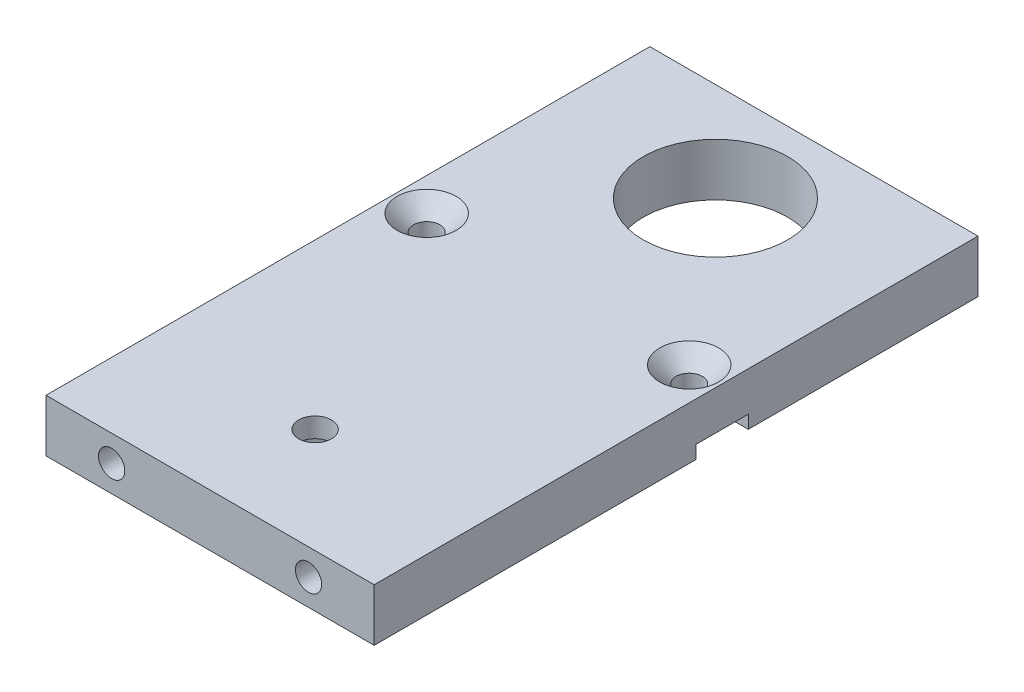
ISO-10303-21;
HEADER;
FILE_DESCRIPTION(('STEP AP214'),'2;1');
FILE_NAME('part.step','',(''),(''),'','','');
FILE_SCHEMA(('AUTOMOTIVE_DESIGN { 1 0 10303 214 1 1 1 1 }'));
ENDSEC;
DATA;
#1=APPLICATION_CONTEXT('core data for automotive mechanical design processes');
#2=APPLICATION_PROTOCOL_DEFINITION('international standard','automotive_design',2000,#1);
#3=PRODUCT_CONTEXT('',#1,'mechanical');
#4=PRODUCT('Part','Part','',(#3));
#5=PRODUCT_RELATED_PRODUCT_CATEGORY('part','',(#4));
#6=PRODUCT_DEFINITION_FORMATION('','',#4);
#7=PRODUCT_DEFINITION_CONTEXT('part definition',#1,'design');
#8=PRODUCT_DEFINITION('design','',#6,#7);
#9=PRODUCT_DEFINITION_SHAPE('','',#8);
#10=(LENGTH_UNIT() NAMED_UNIT(*) SI_UNIT(.MILLI.,.METRE.));
#11=(NAMED_UNIT(*) PLANE_ANGLE_UNIT() SI_UNIT($,.RADIAN.));
#12=(NAMED_UNIT(*) SI_UNIT($,.STERADIAN.) SOLID_ANGLE_UNIT());
#13=UNCERTAINTY_MEASURE_WITH_UNIT(LENGTH_MEASURE(1.E-05),#10,'distance_accuracy_value','');
#14=(GEOMETRIC_REPRESENTATION_CONTEXT(3) GLOBAL_UNCERTAINTY_ASSIGNED_CONTEXT((#13)) GLOBAL_UNIT_ASSIGNED_CONTEXT((#10,
#11,#12)) REPRESENTATION_CONTEXT('',''));
#15=CARTESIAN_POINT('',(0.,0.,0.));
#16=DIRECTION('',(0.,0.,1.));
#17=DIRECTION('',(1.,0.,0.));
#18=AXIS2_PLACEMENT_3D('',#15,#16,#17);
#19=CARTESIAN_POINT('',(0.,0.,0.));
#20=DIRECTION('',(0.,1.,0.));
#21=DIRECTION('',(0.,0.,1.));
#22=AXIS2_PLACEMENT_3D('',#19,#20,#21);
#23=PLANE('',#22);
#24=CARTESIAN_POINT('',(-6.49140893470789,0.,-4.88208118099477));
#25=DIRECTION('',(0.,1.,0.));
#26=DIRECTION('',(0.,0.,1.));
#27=AXIS2_PLACEMENT_3D('',#24,#25,#26);
#28=CIRCLE('',#27,11.);
#29=CARTESIAN_POINT('',(-6.49140893470789,0.,6.11791881900523));
#30=VERTEX_POINT('',#29);
#31=EDGE_CURVE('E162',#30,#30,#28,.T.);
#32=ORIENTED_EDGE('',*,*,#31,.T.);
#33=EDGE_LOOP('',(#32));
#34=FACE_BOUND('',#33,.T.);
#35=DIRECTION('',(0.,0.,-1.));
#36=VECTOR('',#35,1.);
#37=CARTESIAN_POINT('',(18.5085910652921,0.,-19.8820811809948));
#38=LINE('',#37,#36);
#39=CARTESIAN_POINT('',(18.5085910652921,0.,15.1179188190052));
#40=VERTEX_POINT('',#39);
#41=CARTESIAN_POINT('',(18.5085910652921,0.,-19.8820811809948));
#42=VERTEX_POINT('',#41);
#43=EDGE_CURVE('E183',#40,#42,#38,.T.);
#44=ORIENTED_EDGE('',*,*,#43,.F.);
#45=DIRECTION('',(1.,0.,0.));
#46=VECTOR('',#45,1.);
#47=CARTESIAN_POINT('',(18.5085910652921,0.,15.1179188190052));
#48=LINE('',#47,#46);
#49=CARTESIAN_POINT('',(-31.4914089347079,0.,15.1179188190052));
#50=VERTEX_POINT('',#49);
#51=EDGE_CURVE('E124',#50,#40,#48,.T.);
#52=ORIENTED_EDGE('',*,*,#51,.F.);
#53=DIRECTION('',(0.,0.,1.));
#54=VECTOR('',#53,1.);
#55=CARTESIAN_POINT('',(-31.4914089347079,0.,-19.8820811809948));
#56=LINE('',#55,#54);
#57=CARTESIAN_POINT('',(-31.4914089347079,0.,-19.8820811809948));
#58=VERTEX_POINT('',#57);
#59=EDGE_CURVE('E178',#58,#50,#56,.T.);
#60=ORIENTED_EDGE('',*,*,#59,.F.);
#61=DIRECTION('',(-1.,0.,0.));
#62=VECTOR('',#61,1.);
#63=CARTESIAN_POINT('',(-31.4914089347079,0.,-19.8820811809948));
#64=LINE('',#63,#62);
#65=EDGE_CURVE('E79',#42,#58,#64,.T.);
#66=ORIENTED_EDGE('',*,*,#65,.F.);
#67=EDGE_LOOP('',(#44,#52,#60,#66));
#68=FACE_BOUND('',#67,.T.);
#69=ADVANCED_FACE('F33',(#34,#68),#23,.F.);
#70=CARTESIAN_POINT('',(-26.4914089347079,8.,19.1179188190052));
#71=DIRECTION('',(0.,-1.,0.));
#72=DIRECTION('',(0.,0.,-1.));
#73=AXIS2_PLACEMENT_3D('',#70,#71,#72);
#74=CYLINDRICAL_SURFACE('',#73,2.);
#75=CARTESIAN_POINT('',(-26.4914089347079,5.50000000000002,19.1179188190052));
#76=DIRECTION('',(0.,1.,0.));
#77=DIRECTION('',(0.,0.,1.));
#78=AXIS2_PLACEMENT_3D('',#75,#76,#77);
#79=CIRCLE('',#78,2.);
#80=CARTESIAN_POINT('',(-26.4914089347079,5.50000000000002,21.1179188190052));
#81=VERTEX_POINT('',#80);
#82=EDGE_CURVE('E11',#81,#81,#79,.T.);
#83=ORIENTED_EDGE('',*,*,#82,.T.);
#84=EDGE_LOOP('',(#83));
#85=FACE_BOUND('',#84,.T.);
#86=CARTESIAN_POINT('',(-26.4914089347079,2.,19.1179188190052));
#87=DIRECTION('',(0.,-1.,0.));
#88=DIRECTION('',(0.,0.,-1.));
#89=AXIS2_PLACEMENT_3D('',#86,#87,#88);
#90=CIRCLE('',#89,2.);
#91=CARTESIAN_POINT('',(-26.4914089347079,2.,17.1179188190052));
#92=VERTEX_POINT('',#91);
#93=EDGE_CURVE('E137',#92,#92,#90,.T.);
#94=ORIENTED_EDGE('',*,*,#93,.T.);
#95=EDGE_LOOP('',(#94));
#96=FACE_BOUND('',#95,.T.);
#97=ADVANCED_FACE('F214',(#85,#96),#74,.F.);
#98=CARTESIAN_POINT('',(13.5085910652921,8.,19.1179188190052));
#99=DIRECTION('',(0.,-1.,0.));
#100=DIRECTION('',(0.,0.,-1.));
#101=AXIS2_PLACEMENT_3D('',#98,#99,#100);
#102=CYLINDRICAL_SURFACE('',#101,2.);
#103=CARTESIAN_POINT('',(13.5085910652921,5.50000000000002,19.1179188190052));
#104=DIRECTION('',(0.,1.,0.));
#105=DIRECTION('',(0.,0.,1.));
#106=AXIS2_PLACEMENT_3D('',#103,#104,#105);
#107=CIRCLE('',#106,2.);
#108=CARTESIAN_POINT('',(13.5085910652921,5.50000000000002,21.1179188190052));
#109=VERTEX_POINT('',#108);
#110=EDGE_CURVE('E193',#109,#109,#107,.T.);
#111=ORIENTED_EDGE('',*,*,#110,.T.);
#112=EDGE_LOOP('',(#111));
#113=FACE_BOUND('',#112,.T.);
#114=CARTESIAN_POINT('',(13.5085910652921,2.,19.1179188190052));
#115=DIRECTION('',(0.,-1.,0.));
#116=DIRECTION('',(0.,0.,-1.));
#117=AXIS2_PLACEMENT_3D('',#114,#115,#116);
#118=CIRCLE('',#117,2.);
#119=CARTESIAN_POINT('',(13.5085910652921,2.,17.1179188190052));
#120=VERTEX_POINT('',#119);
#121=EDGE_CURVE('E37',#120,#120,#118,.T.);
#122=ORIENTED_EDGE('',*,*,#121,.T.);
#123=EDGE_LOOP('',(#122));
#124=FACE_BOUND('',#123,.T.);
#125=ADVANCED_FACE('F211',(#113,#124),#102,.F.);
#126=CARTESIAN_POINT('',(0.,8.,0.));
#127=DIRECTION('',(0.,1.,0.));
#128=DIRECTION('',(0.,0.,1.));
#129=AXIS2_PLACEMENT_3D('',#126,#127,#128);
#130=PLANE('',#129);
#131=CARTESIAN_POINT('',(-6.49140893470789,8.,56.1179188190052));
#132=DIRECTION('',(0.,-1.,0.));
#133=DIRECTION('',(0.,0.,-1.));
#134=AXIS2_PLACEMENT_3D('',#131,#132,#133);
#135=CIRCLE('',#134,2.5);
#136=CARTESIAN_POINT('',(-6.49140893470789,8.,53.6179188190052));
#137=VERTEX_POINT('',#136);
#138=EDGE_CURVE('E141',#137,#137,#135,.T.);
#139=ORIENTED_EDGE('',*,*,#138,.T.);
#140=EDGE_LOOP('',(#139));
#141=FACE_BOUND('',#140,.T.);
#142=CARTESIAN_POINT('',(13.5085910652921,8.,19.1179188190052));
#143=DIRECTION('',(0.,1.,0.));
#144=DIRECTION('',(0.,0.,1.));
#145=AXIS2_PLACEMENT_3D('',#142,#143,#144);
#146=CIRCLE('',#145,4.50000000000001);
#147=CARTESIAN_POINT('',(13.5085910652921,8.,23.6179188190052));
#148=VERTEX_POINT('',#147);
#149=EDGE_CURVE('E42',#148,#148,#146,.F.);
#150=ORIENTED_EDGE('',*,*,#149,.T.);
#151=EDGE_LOOP('',(#150));
#152=FACE_BOUND('',#151,.T.);
#153=CARTESIAN_POINT('',(-26.4914089347079,8.,19.1179188190052));
#154=DIRECTION('',(0.,1.,0.));
#155=DIRECTION('',(0.,0.,1.));
#156=AXIS2_PLACEMENT_3D('',#153,#154,#155);
#157=CIRCLE('',#156,4.50000000000001);
#158=CARTESIAN_POINT('',(-26.4914089347079,8.,23.6179188190052));
#159=VERTEX_POINT('',#158);
#160=EDGE_CURVE('E196',#159,#159,#157,.F.);
#161=ORIENTED_EDGE('',*,*,#160,.T.);
#162=EDGE_LOOP('',(#161));
#163=FACE_BOUND('',#162,.T.);
#164=DIRECTION('',(0.,0.,1.));
#165=VECTOR('',#164,1.);
#166=CARTESIAN_POINT('',(-31.4914089347079,8.,-19.8820811809948));
#167=LINE('',#166,#165);
#168=CARTESIAN_POINT('',(-31.4914089347079,8.,-19.8820811809948));
#169=VERTEX_POINT('',#168);
#170=CARTESIAN_POINT('',(-31.4914089347079,8.,72.1179188190052));
#171=VERTEX_POINT('',#170);
#172=EDGE_CURVE('E171',#169,#171,#167,.T.);
#173=ORIENTED_EDGE('',*,*,#172,.T.);
#174=DIRECTION('',(1.,0.,0.));
#175=VECTOR('',#174,1.);
#176=CARTESIAN_POINT('',(-31.4914089347079,8.,72.1179188190052));
#177=LINE('',#176,#175);
#178=CARTESIAN_POINT('',(18.5085910652921,8.,72.1179188190052));
#179=VERTEX_POINT('',#178);
#180=EDGE_CURVE('E87',#171,#179,#177,.T.);
#181=ORIENTED_EDGE('',*,*,#180,.T.);
#182=DIRECTION('',(0.,0.,-1.));
#183=VECTOR('',#182,1.);
#184=CARTESIAN_POINT('',(18.5085910652921,8.,-19.8820811809948));
#185=LINE('',#184,#183);
#186=CARTESIAN_POINT('',(18.5085910652921,8.,-19.8820811809948));
#187=VERTEX_POINT('',#186);
#188=EDGE_CURVE('E174',#179,#187,#185,.T.);
#189=ORIENTED_EDGE('',*,*,#188,.T.);
#190=DIRECTION('',(-1.,0.,0.));
#191=VECTOR('',#190,1.);
#192=CARTESIAN_POINT('',(-31.4914089347079,8.,-19.8820811809948));
#193=LINE('',#192,#191);
#194=EDGE_CURVE('E58',#187,#169,#193,.T.);
#195=ORIENTED_EDGE('',*,*,#194,.T.);
#196=EDGE_LOOP('',(#173,#181,#189,#195));
#197=FACE_BOUND('',#196,.T.);
#198=CARTESIAN_POINT('',(-6.49140893470789,8.,-4.88208118099477));
#199=DIRECTION('',(0.,1.,0.));
#200=DIRECTION('',(0.,0.,1.));
#201=AXIS2_PLACEMENT_3D('',#198,#199,#200);
#202=CIRCLE('',#201,11.);
#203=CARTESIAN_POINT('',(-6.49140893470789,8.,6.11791881900523));
#204=VERTEX_POINT('',#203);
#205=EDGE_CURVE('E165',#204,#204,#202,.T.);
#206=ORIENTED_EDGE('',*,*,#205,.F.);
#207=EDGE_LOOP('',(#206));
#208=FACE_BOUND('',#207,.T.);
#209=ADVANCED_FACE('F202',(#141,#152,#163,#197,#208),#130,.T.);
#210=CARTESIAN_POINT('',(-6.49140893470789,0.,56.1179188190052));
#211=DIRECTION('',(0.,-1.,0.));
#212=DIRECTION('',(0.,0.,-1.));
#213=AXIS2_PLACEMENT_3D('',#210,#211,#212);
#214=CIRCLE('',#213,8.);
#215=CARTESIAN_POINT('',(-6.49140893470789,0.,48.1179188190052));
#216=VERTEX_POINT('',#215);
#217=EDGE_CURVE('E144',#216,#216,#214,.T.);
#218=ORIENTED_EDGE('',*,*,#217,.F.);
#219=EDGE_LOOP('',(#218));
#220=FACE_BOUND('',#219,.T.);
#221=CARTESIAN_POINT('',(-31.4914089347079,0.,23.1179188190052));
#222=VERTEX_POINT('',#221);
#223=CARTESIAN_POINT('',(-31.4914089347079,0.,72.1179188190052));
#224=VERTEX_POINT('',#223);
#225=EDGE_CURVE('E168',#222,#224,#56,.T.);
#226=ORIENTED_EDGE('',*,*,#225,.F.);
#227=DIRECTION('',(-1.,0.,0.));
#228=VECTOR('',#227,1.);
#229=CARTESIAN_POINT('',(18.5085910652921,0.,23.1179188190052));
#230=LINE('',#229,#228);
#231=CARTESIAN_POINT('',(18.5085910652921,0.,23.1179188190052));
#232=VERTEX_POINT('',#231);
#233=EDGE_CURVE('E224',#232,#222,#230,.T.);
#234=ORIENTED_EDGE('',*,*,#233,.F.);
#235=CARTESIAN_POINT('',(18.5085910652921,0.,72.1179188190052));
#236=VERTEX_POINT('',#235);
#237=EDGE_CURVE('E130',#236,#232,#38,.T.);
#238=ORIENTED_EDGE('',*,*,#237,.F.);
#239=DIRECTION('',(1.,0.,0.));
#240=VECTOR('',#239,1.);
#241=CARTESIAN_POINT('',(-31.4914089347079,0.,72.1179188190052));
#242=LINE('',#241,#240);
#243=EDGE_CURVE('E181',#224,#236,#242,.T.);
#244=ORIENTED_EDGE('',*,*,#243,.F.);
#245=EDGE_LOOP('',(#226,#234,#238,#244));
#246=FACE_BOUND('',#245,.T.);
#247=ADVANCED_FACE('F244',(#220,#246),#23,.F.);
#248=CARTESIAN_POINT('',(-31.4914089347079,8.,-19.8820811809948));
#249=DIRECTION('',(1.,0.,0.));
#250=DIRECTION('',(0.,0.,-1.));
#251=AXIS2_PLACEMENT_3D('',#248,#249,#250);
#252=PLANE('',#251);
#253=ORIENTED_EDGE('',*,*,#59,.T.);
#254=DIRECTION('',(0.,-1.,0.));
#255=VECTOR('',#254,1.);
#256=CARTESIAN_POINT('',(-31.4914089347079,2.,15.1179188190052));
#257=LINE('',#256,#255);
#258=CARTESIAN_POINT('',(-31.4914089347079,2.,15.1179188190052));
#259=VERTEX_POINT('',#258);
#260=EDGE_CURVE('E132',#259,#50,#257,.T.);
#261=ORIENTED_EDGE('',*,*,#260,.F.);
#262=DIRECTION('',(0.,0.,-1.));
#263=VECTOR('',#262,1.);
#264=CARTESIAN_POINT('',(-31.4914089347079,2.,15.1179188190052));
#265=LINE('',#264,#263);
#266=CARTESIAN_POINT('',(-31.4914089347079,2.,23.1179188190052));
#267=VERTEX_POINT('',#266);
#268=EDGE_CURVE('E117',#267,#259,#265,.T.);
#269=ORIENTED_EDGE('',*,*,#268,.F.);
#270=DIRECTION('',(0.,-1.,0.));
#271=VECTOR('',#270,1.);
#272=CARTESIAN_POINT('',(-31.4914089347079,2.,23.1179188190052));
#273=LINE('',#272,#271);
#274=EDGE_CURVE('E115',#267,#222,#273,.T.);
#275=ORIENTED_EDGE('',*,*,#274,.T.);
#276=ORIENTED_EDGE('',*,*,#225,.T.);
#277=DIRECTION('',(0.,-1.,0.));
#278=VECTOR('',#277,1.);
#279=CARTESIAN_POINT('',(-31.4914089347079,8.,72.1179188190052));
#280=LINE('',#279,#278);
#281=EDGE_CURVE('E191',#171,#224,#280,.T.);
#282=ORIENTED_EDGE('',*,*,#281,.F.);
#283=ORIENTED_EDGE('',*,*,#172,.F.);
#284=DIRECTION('',(0.,-1.,0.));
#285=VECTOR('',#284,1.);
#286=CARTESIAN_POINT('',(-31.4914089347079,8.,-19.8820811809948));
#287=LINE('',#286,#285);
#288=EDGE_CURVE('E177',#169,#58,#287,.T.);
#289=ORIENTED_EDGE('',*,*,#288,.T.);
#290=EDGE_LOOP('',(#253,#261,#269,#275,#276,#282,#283,#289));
#291=FACE_BOUND('',#290,.T.);
#292=ADVANCED_FACE('F231',(#291),#252,.F.);
#293=CARTESIAN_POINT('',(-31.4914089347079,8.,72.1179188190052));
#294=DIRECTION('',(0.,0.,-1.));
#295=DIRECTION('',(-1.,0.,0.));
#296=AXIS2_PLACEMENT_3D('',#293,#294,#295);
#297=PLANE('',#296);
#298=CARTESIAN_POINT('',(8.50859106529211,4.,72.1179188190052));
#299=DIRECTION('',(0.,0.,1.));
#300=DIRECTION('',(1.,0.,0.));
#301=AXIS2_PLACEMENT_3D('',#298,#299,#300);
#302=CIRCLE('',#301,2.);
#303=CARTESIAN_POINT('',(10.5085910652921,4.,72.1179188190052));
#304=VERTEX_POINT('',#303);
#305=EDGE_CURVE('E150',#304,#304,#302,.T.);
#306=ORIENTED_EDGE('',*,*,#305,.F.);
#307=EDGE_LOOP('',(#306));
#308=FACE_BOUND('',#307,.T.);
#309=CARTESIAN_POINT('',(-21.4914089347079,4.,72.1179188190052));
#310=DIRECTION('',(0.,0.,1.));
#311=DIRECTION('',(1.,0.,0.));
#312=AXIS2_PLACEMENT_3D('',#309,#310,#311);
#313=CIRCLE('',#312,2.00000000000001);
#314=CARTESIAN_POINT('',(-19.4914089347079,4.,72.1179188190052));
#315=VERTEX_POINT('',#314);
#316=EDGE_CURVE('E156',#315,#315,#313,.T.);
#317=ORIENTED_EDGE('',*,*,#316,.F.);
#318=EDGE_LOOP('',(#317));
#319=FACE_BOUND('',#318,.T.);
#320=ORIENTED_EDGE('',*,*,#243,.T.);
#321=DIRECTION('',(0.,-1.,0.));
#322=VECTOR('',#321,1.);
#323=CARTESIAN_POINT('',(18.5085910652921,8.,72.1179188190052));
#324=LINE('',#323,#322);
#325=EDGE_CURVE('E189',#179,#236,#324,.T.);
#326=ORIENTED_EDGE('',*,*,#325,.F.);
#327=ORIENTED_EDGE('',*,*,#180,.F.);
#328=ORIENTED_EDGE('',*,*,#281,.T.);
#329=EDGE_LOOP('',(#320,#326,#327,#328));
#330=FACE_BOUND('',#329,.T.);
#331=ADVANCED_FACE('F240',(#308,#319,#330),#297,.F.);
#332=CARTESIAN_POINT('',(18.5085910652921,8.,-19.8820811809948));
#333=DIRECTION('',(-1.,0.,0.));
#334=DIRECTION('',(0.,0.,1.));
#335=AXIS2_PLACEMENT_3D('',#332,#333,#334);
#336=PLANE('',#335);
#337=DIRECTION('',(0.,0.,1.));
#338=VECTOR('',#337,1.);
#339=CARTESIAN_POINT('',(18.5085910652921,2.,15.1179188190052));
#340=LINE('',#339,#338);
#341=CARTESIAN_POINT('',(18.5085910652921,2.,15.1179188190052));
#342=VERTEX_POINT('',#341);
#343=CARTESIAN_POINT('',(18.5085910652921,2.,23.1179188190052));
#344=VERTEX_POINT('',#343);
#345=EDGE_CURVE('E118',#342,#344,#340,.T.);
#346=ORIENTED_EDGE('',*,*,#345,.F.);
#347=DIRECTION('',(0.,-1.,0.));
#348=VECTOR('',#347,1.);
#349=CARTESIAN_POINT('',(18.5085910652921,2.,15.1179188190052));
#350=LINE('',#349,#348);
#351=EDGE_CURVE('E219',#342,#40,#350,.T.);
#352=ORIENTED_EDGE('',*,*,#351,.T.);
#353=ORIENTED_EDGE('',*,*,#43,.T.);
#354=DIRECTION('',(0.,-1.,0.));
#355=VECTOR('',#354,1.);
#356=CARTESIAN_POINT('',(18.5085910652921,8.,-19.8820811809948));
#357=LINE('',#356,#355);
#358=EDGE_CURVE('E187',#187,#42,#357,.T.);
#359=ORIENTED_EDGE('',*,*,#358,.F.);
#360=ORIENTED_EDGE('',*,*,#188,.F.);
#361=ORIENTED_EDGE('',*,*,#325,.T.);
#362=ORIENTED_EDGE('',*,*,#237,.T.);
#363=DIRECTION('',(0.,-1.,0.));
#364=VECTOR('',#363,1.);
#365=CARTESIAN_POINT('',(18.5085910652921,2.,23.1179188190052));
#366=LINE('',#365,#364);
#367=EDGE_CURVE('E112',#344,#232,#366,.T.);
#368=ORIENTED_EDGE('',*,*,#367,.F.);
#369=EDGE_LOOP('',(#346,#352,#353,#359,#360,#361,#362,#368));
#370=FACE_BOUND('',#369,.T.);
#371=ADVANCED_FACE('F127',(#370),#336,.F.);
#372=CARTESIAN_POINT('',(-31.4914089347079,8.,-19.8820811809948));
#373=DIRECTION('',(0.,0.,1.));
#374=DIRECTION('',(1.,0.,0.));
#375=AXIS2_PLACEMENT_3D('',#372,#373,#374);
#376=PLANE('',#375);
#377=ORIENTED_EDGE('',*,*,#65,.T.);
#378=ORIENTED_EDGE('',*,*,#288,.F.);
#379=ORIENTED_EDGE('',*,*,#194,.F.);
#380=ORIENTED_EDGE('',*,*,#358,.T.);
#381=EDGE_LOOP('',(#377,#378,#379,#380));
#382=FACE_BOUND('',#381,.T.);
#383=ADVANCED_FACE('F237',(#382),#376,.F.);
#384=CARTESIAN_POINT('',(-6.49140893470789,8.,-4.88208118099477));
#385=DIRECTION('',(0.,-1.,0.));
#386=DIRECTION('',(0.,0.,-1.));
#387=AXIS2_PLACEMENT_3D('',#384,#385,#386);
#388=CYLINDRICAL_SURFACE('',#387,11.);
#389=ORIENTED_EDGE('',*,*,#205,.T.);
#390=EDGE_LOOP('',(#389));
#391=FACE_BOUND('',#390,.T.);
#392=ORIENTED_EDGE('',*,*,#31,.F.);
#393=EDGE_LOOP('',(#392));
#394=FACE_BOUND('',#393,.T.);
#395=ADVANCED_FACE('F208',(#391,#394),#388,.F.);
#396=CARTESIAN_POINT('',(13.5085910652921,5.50000000000002,19.1179188190052));
#397=DIRECTION('',(0.,1.,0.));
#398=DIRECTION('',(0.,0.,1.));
#399=AXIS2_PLACEMENT_3D('',#396,#397,#398);
#400=CONICAL_SURFACE('',#399,2.,0.785398163397453);
#401=ORIENTED_EDGE('',*,*,#149,.F.);
#402=EDGE_LOOP('',(#401));
#403=FACE_BOUND('',#402,.T.);
#404=ORIENTED_EDGE('',*,*,#110,.F.);
#405=EDGE_LOOP('',(#404));
#406=FACE_BOUND('',#405,.T.);
#407=ADVANCED_FACE('F205',(#403,#406),#400,.F.);
#408=CARTESIAN_POINT('',(-26.4914089347079,5.50000000000002,19.1179188190052));
#409=DIRECTION('',(0.,1.,0.));
#410=DIRECTION('',(0.,0.,1.));
#411=AXIS2_PLACEMENT_3D('',#408,#409,#410);
#412=CONICAL_SURFACE('',#411,2.,0.785398163397453);
#413=ORIENTED_EDGE('',*,*,#160,.F.);
#414=EDGE_LOOP('',(#413));
#415=FACE_BOUND('',#414,.T.);
#416=ORIENTED_EDGE('',*,*,#82,.F.);
#417=EDGE_LOOP('',(#416));
#418=FACE_BOUND('',#417,.T.);
#419=ADVANCED_FACE('F35',(#415,#418),#412,.F.);
#420=CARTESIAN_POINT('',(-21.4914089347079,4.,62.1179188190052));
#421=DIRECTION('',(0.,0.,1.));
#422=DIRECTION('',(1.,0.,0.));
#423=AXIS2_PLACEMENT_3D('',#420,#421,#422);
#424=CYLINDRICAL_SURFACE('',#423,2.00000000000001);
#425=CARTESIAN_POINT('',(-21.4914089347079,4.,62.1179188190052));
#426=DIRECTION('',(0.,0.,1.));
#427=DIRECTION('',(1.,0.,0.));
#428=AXIS2_PLACEMENT_3D('',#425,#426,#427);
#429=CIRCLE('',#428,2.00000000000001);
#430=CARTESIAN_POINT('',(-19.4914089347079,4.,62.1179188190052));
#431=VERTEX_POINT('',#430);
#432=EDGE_CURVE('E159',#431,#431,#429,.T.);
#433=ORIENTED_EDGE('',*,*,#432,.F.);
#434=EDGE_LOOP('',(#433));
#435=FACE_BOUND('',#434,.T.);
#436=ORIENTED_EDGE('',*,*,#316,.T.);
#437=EDGE_LOOP('',(#436));
#438=FACE_BOUND('',#437,.T.);
#439=ADVANCED_FACE('F274',(#435,#438),#424,.F.);
#440=CARTESIAN_POINT('',(-21.4914089347079,4.,62.1179188190052));
#441=DIRECTION('',(0.,0.,1.));
#442=DIRECTION('',(1.,0.,0.));
#443=AXIS2_PLACEMENT_3D('',#440,#441,#442);
#444=PLANE('',#443);
#445=ORIENTED_EDGE('',*,*,#432,.T.);
#446=EDGE_LOOP('',(#445));
#447=FACE_BOUND('',#446,.T.);
#448=ADVANCED_FACE('F277',(#447),#444,.T.);
#449=CARTESIAN_POINT('',(8.50859106529211,4.,62.1179188190052));
#450=DIRECTION('',(0.,0.,1.));
#451=DIRECTION('',(1.,0.,0.));
#452=AXIS2_PLACEMENT_3D('',#449,#450,#451);
#453=CYLINDRICAL_SURFACE('',#452,2.);
#454=CARTESIAN_POINT('',(8.50859106529211,4.,62.1179188190052));
#455=DIRECTION('',(0.,0.,1.));
#456=DIRECTION('',(1.,0.,0.));
#457=AXIS2_PLACEMENT_3D('',#454,#455,#456);
#458=CIRCLE('',#457,2.);
#459=CARTESIAN_POINT('',(10.5085910652921,4.,62.1179188190052));
#460=VERTEX_POINT('',#459);
#461=EDGE_CURVE('E153',#460,#460,#458,.T.);
#462=ORIENTED_EDGE('',*,*,#461,.F.);
#463=EDGE_LOOP('',(#462));
#464=FACE_BOUND('',#463,.T.);
#465=ORIENTED_EDGE('',*,*,#305,.T.);
#466=EDGE_LOOP('',(#465));
#467=FACE_BOUND('',#466,.T.);
#468=ADVANCED_FACE('F281',(#464,#467),#453,.F.);
#469=CARTESIAN_POINT('',(8.50859106529211,4.,62.1179188190052));
#470=DIRECTION('',(0.,0.,1.));
#471=DIRECTION('',(1.,0.,0.));
#472=AXIS2_PLACEMENT_3D('',#469,#470,#471);
#473=PLANE('',#472);
#474=ORIENTED_EDGE('',*,*,#461,.T.);
#475=EDGE_LOOP('',(#474));
#476=FACE_BOUND('',#475,.T.);
#477=ADVANCED_FACE('F285',(#476),#473,.T.);
#478=CARTESIAN_POINT('',(-6.49140893470789,5.,56.1179188190052));
#479=DIRECTION('',(0.,-1.,0.));
#480=DIRECTION('',(0.,0.,-1.));
#481=AXIS2_PLACEMENT_3D('',#478,#479,#480);
#482=CYLINDRICAL_SURFACE('',#481,8.);
#483=CARTESIAN_POINT('',(-6.49140893470789,5.,56.1179188190052));
#484=DIRECTION('',(0.,-1.,0.));
#485=DIRECTION('',(0.,0.,-1.));
#486=AXIS2_PLACEMENT_3D('',#483,#484,#485);
#487=CIRCLE('',#486,8.);
#488=CARTESIAN_POINT('',(-6.49140893470789,5.,48.1179188190052));
#489=VERTEX_POINT('',#488);
#490=EDGE_CURVE('E147',#489,#489,#487,.T.);
#491=ORIENTED_EDGE('',*,*,#490,.F.);
#492=EDGE_LOOP('',(#491));
#493=FACE_BOUND('',#492,.T.);
#494=ORIENTED_EDGE('',*,*,#217,.T.);
#495=EDGE_LOOP('',(#494));
#496=FACE_BOUND('',#495,.T.);
#497=ADVANCED_FACE('F289',(#493,#496),#482,.F.);
#498=CARTESIAN_POINT('',(-6.49140893470789,5.,56.1179188190052));
#499=DIRECTION('',(0.,-1.,0.));
#500=DIRECTION('',(0.,0.,-1.));
#501=AXIS2_PLACEMENT_3D('',#498,#499,#500);
#502=PLANE('',#501);
#503=CARTESIAN_POINT('',(-6.49140893470789,5.,56.1179188190052));
#504=DIRECTION('',(0.,-1.,0.));
#505=DIRECTION('',(0.,0.,-1.));
#506=AXIS2_PLACEMENT_3D('',#503,#504,#505);
#507=CIRCLE('',#506,2.5);
#508=CARTESIAN_POINT('',(-6.49140893470789,5.,53.6179188190052));
#509=VERTEX_POINT('',#508);
#510=EDGE_CURVE('E140',#509,#509,#507,.T.);
#511=ORIENTED_EDGE('',*,*,#510,.F.);
#512=EDGE_LOOP('',(#511));
#513=FACE_BOUND('',#512,.T.);
#514=ORIENTED_EDGE('',*,*,#490,.T.);
#515=EDGE_LOOP('',(#514));
#516=FACE_BOUND('',#515,.T.);
#517=ADVANCED_FACE('F293',(#513,#516),#502,.T.);
#518=CARTESIAN_POINT('',(-6.49140893470789,8.,56.1179188190052));
#519=DIRECTION('',(0.,-1.,0.));
#520=DIRECTION('',(0.,0.,-1.));
#521=AXIS2_PLACEMENT_3D('',#518,#519,#520);
#522=CYLINDRICAL_SURFACE('',#521,2.5);
#523=ORIENTED_EDGE('',*,*,#138,.F.);
#524=EDGE_LOOP('',(#523));
#525=FACE_BOUND('',#524,.T.);
#526=ORIENTED_EDGE('',*,*,#510,.T.);
#527=EDGE_LOOP('',(#526));
#528=FACE_BOUND('',#527,.T.);
#529=ADVANCED_FACE('F297',(#525,#528),#522,.F.);
#530=CARTESIAN_POINT('',(18.5085910652921,2.,15.1179188190052));
#531=DIRECTION('',(0.,0.,-1.));
#532=DIRECTION('',(-1.,0.,0.));
#533=AXIS2_PLACEMENT_3D('',#530,#531,#532);
#534=PLANE('',#533);
#535=ORIENTED_EDGE('',*,*,#51,.T.);
#536=ORIENTED_EDGE('',*,*,#351,.F.);
#537=DIRECTION('',(1.,0.,0.));
#538=VECTOR('',#537,1.);
#539=CARTESIAN_POINT('',(18.5085910652921,2.,15.1179188190052));
#540=LINE('',#539,#538);
#541=EDGE_CURVE('E49',#259,#342,#540,.T.);
#542=ORIENTED_EDGE('',*,*,#541,.F.);
#543=ORIENTED_EDGE('',*,*,#260,.T.);
#544=EDGE_LOOP('',(#535,#536,#542,#543));
#545=FACE_BOUND('',#544,.T.);
#546=ADVANCED_FACE('F229',(#545),#534,.F.);
#547=CARTESIAN_POINT('',(18.5085910652921,2.,23.1179188190052));
#548=DIRECTION('',(0.,0.,1.));
#549=DIRECTION('',(1.,0.,0.));
#550=AXIS2_PLACEMENT_3D('',#547,#548,#549);
#551=PLANE('',#550);
#552=ORIENTED_EDGE('',*,*,#233,.T.);
#553=ORIENTED_EDGE('',*,*,#274,.F.);
#554=DIRECTION('',(-1.,0.,0.));
#555=VECTOR('',#554,1.);
#556=CARTESIAN_POINT('',(18.5085910652921,2.,23.1179188190052));
#557=LINE('',#556,#555);
#558=EDGE_CURVE('E109',#344,#267,#557,.T.);
#559=ORIENTED_EDGE('',*,*,#558,.F.);
#560=ORIENTED_EDGE('',*,*,#367,.T.);
#561=EDGE_LOOP('',(#552,#553,#559,#560));
#562=FACE_BOUND('',#561,.T.);
#563=ADVANCED_FACE('F110',(#562),#551,.F.);
#564=CARTESIAN_POINT('',(0.,2.,0.));
#565=DIRECTION('',(0.,-1.,0.));
#566=DIRECTION('',(0.,0.,-1.));
#567=AXIS2_PLACEMENT_3D('',#564,#565,#566);
#568=PLANE('',#567);
#569=ORIENTED_EDGE('',*,*,#93,.F.);
#570=EDGE_LOOP('',(#569));
#571=FACE_BOUND('',#570,.T.);
#572=ORIENTED_EDGE('',*,*,#121,.F.);
#573=EDGE_LOOP('',(#572));
#574=FACE_BOUND('',#573,.T.);
#575=ORIENTED_EDGE('',*,*,#345,.T.);
#576=ORIENTED_EDGE('',*,*,#558,.T.);
#577=ORIENTED_EDGE('',*,*,#268,.T.);
#578=ORIENTED_EDGE('',*,*,#541,.T.);
#579=EDGE_LOOP('',(#575,#576,#577,#578));
#580=FACE_BOUND('',#579,.T.);
#581=ADVANCED_FACE('F121',(#571,#574,#580),#568,.T.);
#582=CLOSED_SHELL('',(#69,#97,#125,#209,#247,#292,#331,#371,#383,#395,#407,#419,#439,#448,#468,
#477,#497,#517,#529,#546,#563,#581));
#583=MANIFOLD_SOLID_BREP('B2',#582);
#584=ADVANCED_BREP_SHAPE_REPRESENTATION('',(#18,#583),#14);
#585=SHAPE_DEFINITION_REPRESENTATION(#9,#584);
ENDSEC;
END-ISO-10303-21;
